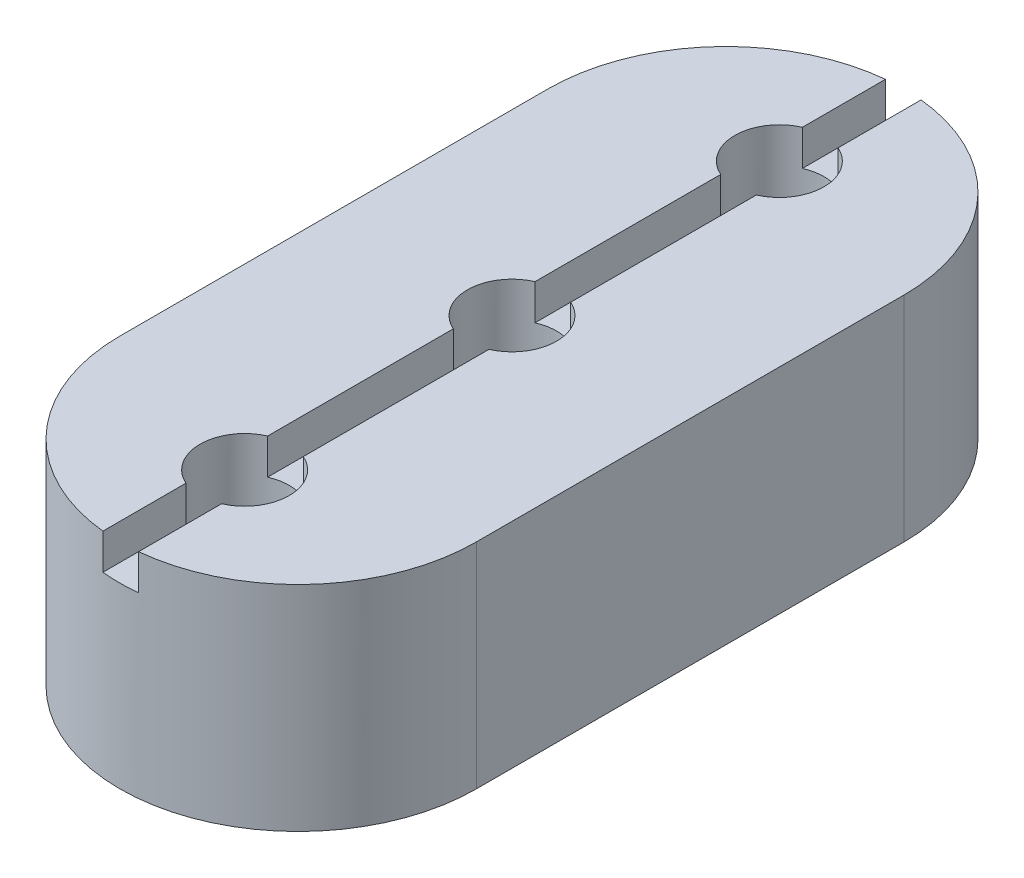
ISO-10303-21;
HEADER;
FILE_DESCRIPTION(('STEP AP214'),'2;1');
FILE_NAME('part.step','',(''),(''),'','','');
FILE_SCHEMA(('AUTOMOTIVE_DESIGN { 1 0 10303 214 1 1 1 1 }'));
ENDSEC;
DATA;
#1=APPLICATION_CONTEXT('core data for automotive mechanical design processes');
#2=APPLICATION_PROTOCOL_DEFINITION('international standard','automotive_design',2000,#1);
#3=PRODUCT_CONTEXT('',#1,'mechanical');
#4=PRODUCT('Part','Part','',(#3));
#5=PRODUCT_RELATED_PRODUCT_CATEGORY('part','',(#4));
#6=PRODUCT_DEFINITION_FORMATION('','',#4);
#7=PRODUCT_DEFINITION_CONTEXT('part definition',#1,'design');
#8=PRODUCT_DEFINITION('design','',#6,#7);
#9=PRODUCT_DEFINITION_SHAPE('','',#8);
#10=(LENGTH_UNIT() NAMED_UNIT(*) SI_UNIT(.MILLI.,.METRE.));
#11=(NAMED_UNIT(*) PLANE_ANGLE_UNIT() SI_UNIT($,.RADIAN.));
#12=(NAMED_UNIT(*) SI_UNIT($,.STERADIAN.) SOLID_ANGLE_UNIT());
#13=UNCERTAINTY_MEASURE_WITH_UNIT(LENGTH_MEASURE(1.E-05),#10,'distance_accuracy_value','');
#14=(GEOMETRIC_REPRESENTATION_CONTEXT(3) GLOBAL_UNCERTAINTY_ASSIGNED_CONTEXT((#13)) GLOBAL_UNIT_ASSIGNED_CONTEXT((#10,
#11,#12)) REPRESENTATION_CONTEXT('',''));
#15=CARTESIAN_POINT('',(0.,0.,0.));
#16=DIRECTION('',(0.,0.,1.));
#17=DIRECTION('',(1.,0.,0.));
#18=AXIS2_PLACEMENT_3D('',#15,#16,#17);
#19=CARTESIAN_POINT('',(0.,6.,12.));
#20=DIRECTION('',(0.,1.,0.));
#21=DIRECTION('',(0.,0.,1.));
#22=AXIS2_PLACEMENT_3D('',#19,#20,#21);
#23=CYLINDRICAL_SURFACE('',#22,10.);
#24=DIRECTION('',(0.,1.,0.));
#25=VECTOR('',#24,1.);
#26=CARTESIAN_POINT('',(10.,6.,12.));
#27=LINE('',#26,#25);
#28=CARTESIAN_POINT('',(10.,6.,12.));
#29=VERTEX_POINT('',#28);
#30=CARTESIAN_POINT('',(10.,-6.,12.));
#31=VERTEX_POINT('',#30);
#32=EDGE_CURVE('E309',#29,#31,#27,.F.);
#33=ORIENTED_EDGE('',*,*,#32,.F.);
#34=CARTESIAN_POINT('',(0.,6.,12.));
#35=DIRECTION('',(0.,-1.,0.));
#36=DIRECTION('',(0.,0.,-1.));
#37=AXIS2_PLACEMENT_3D('',#34,#35,#36);
#38=CIRCLE('',#37,10.);
#39=CARTESIAN_POINT('',(0.999999999999999,6.,21.9498743710662));
#40=VERTEX_POINT('',#39);
#41=EDGE_CURVE('E61',#40,#29,#38,.F.);
#42=ORIENTED_EDGE('',*,*,#41,.F.);
#43=DIRECTION('',(0.,1.,0.));
#44=VECTOR('',#43,1.);
#45=CARTESIAN_POINT('',(0.999999999999999,6.,21.9498743710662));
#46=LINE('',#45,#44);
#47=CARTESIAN_POINT('',(1.,4.,21.9498743710662));
#48=VERTEX_POINT('',#47);
#49=EDGE_CURVE('E71',#48,#40,#46,.T.);
#50=ORIENTED_EDGE('',*,*,#49,.F.);
#51=CARTESIAN_POINT('',(0.,4.,12.));
#52=DIRECTION('',(0.,-1.,0.));
#53=DIRECTION('',(0.,0.,-1.));
#54=AXIS2_PLACEMENT_3D('',#51,#52,#53);
#55=CIRCLE('',#54,10.);
#56=CARTESIAN_POINT('',(-1.,4.,21.9498743710662));
#57=VERTEX_POINT('',#56);
#58=EDGE_CURVE('E322',#57,#48,#55,.F.);
#59=ORIENTED_EDGE('',*,*,#58,.F.);
#60=DIRECTION('',(0.,1.,0.));
#61=VECTOR('',#60,1.);
#62=CARTESIAN_POINT('',(-1.,6.,21.9498743710662));
#63=LINE('',#62,#61);
#64=CARTESIAN_POINT('',(-1.,6.,21.9498743710662));
#65=VERTEX_POINT('',#64);
#66=EDGE_CURVE('E319',#65,#57,#63,.F.);
#67=ORIENTED_EDGE('',*,*,#66,.F.);
#68=CARTESIAN_POINT('',(0.,6.,12.));
#69=DIRECTION('',(0.,-1.,0.));
#70=DIRECTION('',(0.,0.,-1.));
#71=AXIS2_PLACEMENT_3D('',#68,#69,#70);
#72=CIRCLE('',#71,10.);
#73=CARTESIAN_POINT('',(-10.,6.,12.));
#74=VERTEX_POINT('',#73);
#75=EDGE_CURVE('E194',#74,#65,#72,.F.);
#76=ORIENTED_EDGE('',*,*,#75,.F.);
#77=DIRECTION('',(0.,1.,0.));
#78=VECTOR('',#77,1.);
#79=CARTESIAN_POINT('',(-10.,6.,12.));
#80=LINE('',#79,#78);
#81=CARTESIAN_POINT('',(-10.,-6.,12.));
#82=VERTEX_POINT('',#81);
#83=EDGE_CURVE('E313',#82,#74,#80,.T.);
#84=ORIENTED_EDGE('',*,*,#83,.F.);
#85=CARTESIAN_POINT('',(0.,-6.,12.));
#86=DIRECTION('',(0.,1.,0.));
#87=DIRECTION('',(0.,0.,1.));
#88=AXIS2_PLACEMENT_3D('',#85,#86,#87);
#89=CIRCLE('',#88,10.);
#90=EDGE_CURVE('E13',#31,#82,#89,.F.);
#91=ORIENTED_EDGE('',*,*,#90,.F.);
#92=EDGE_LOOP('',(#33,#42,#50,#59,#67,#76,#84,#91));
#93=FACE_BOUND('',#92,.T.);
#94=ADVANCED_FACE('F52',(#93),#23,.T.);
#95=CARTESIAN_POINT('',(0.,6.,-12.));
#96=DIRECTION('',(0.,-1.,0.));
#97=DIRECTION('',(0.,0.,-1.));
#98=AXIS2_PLACEMENT_3D('',#95,#96,#97);
#99=CYLINDRICAL_SURFACE('',#98,10.);
#100=DIRECTION('',(0.,1.,0.));
#101=VECTOR('',#100,1.);
#102=CARTESIAN_POINT('',(-10.,6.,-12.));
#103=LINE('',#102,#101);
#104=CARTESIAN_POINT('',(-10.,6.,-12.));
#105=VERTEX_POINT('',#104);
#106=CARTESIAN_POINT('',(-10.,-6.,-12.));
#107=VERTEX_POINT('',#106);
#108=EDGE_CURVE('E278',#105,#107,#103,.F.);
#109=ORIENTED_EDGE('',*,*,#108,.F.);
#110=CARTESIAN_POINT('',(0.,6.,-12.));
#111=DIRECTION('',(0.,-1.,0.));
#112=DIRECTION('',(0.,0.,-1.));
#113=AXIS2_PLACEMENT_3D('',#110,#111,#112);
#114=CIRCLE('',#113,10.);
#115=CARTESIAN_POINT('',(-1.,6.,-21.9498743710662));
#116=VERTEX_POINT('',#115);
#117=EDGE_CURVE('E302',#116,#105,#114,.F.);
#118=ORIENTED_EDGE('',*,*,#117,.F.);
#119=DIRECTION('',(0.,-1.,0.));
#120=VECTOR('',#119,1.);
#121=CARTESIAN_POINT('',(-1.,6.,-21.9498743710662));
#122=LINE('',#121,#120);
#123=CARTESIAN_POINT('',(-1.,4.,-21.9498743710662));
#124=VERTEX_POINT('',#123);
#125=EDGE_CURVE('E298',#124,#116,#122,.F.);
#126=ORIENTED_EDGE('',*,*,#125,.F.);
#127=CARTESIAN_POINT('',(0.,4.,-12.));
#128=DIRECTION('',(0.,-1.,0.));
#129=DIRECTION('',(0.,0.,-1.));
#130=AXIS2_PLACEMENT_3D('',#127,#128,#129);
#131=CIRCLE('',#130,10.);
#132=CARTESIAN_POINT('',(1.,4.,-21.9498743710662));
#133=VERTEX_POINT('',#132);
#134=EDGE_CURVE('E294',#133,#124,#131,.F.);
#135=ORIENTED_EDGE('',*,*,#134,.F.);
#136=DIRECTION('',(0.,-1.,0.));
#137=VECTOR('',#136,1.);
#138=CARTESIAN_POINT('',(0.999999999999999,6.,-21.9498743710662));
#139=LINE('',#138,#137);
#140=CARTESIAN_POINT('',(0.999999999999999,6.,-21.9498743710662));
#141=VERTEX_POINT('',#140);
#142=EDGE_CURVE('E290',#141,#133,#139,.T.);
#143=ORIENTED_EDGE('',*,*,#142,.F.);
#144=CARTESIAN_POINT('',(0.,6.,-12.));
#145=DIRECTION('',(0.,-1.,0.));
#146=DIRECTION('',(0.,0.,-1.));
#147=AXIS2_PLACEMENT_3D('',#144,#145,#146);
#148=CIRCLE('',#147,10.);
#149=CARTESIAN_POINT('',(10.,6.,-12.));
#150=VERTEX_POINT('',#149);
#151=EDGE_CURVE('E286',#150,#141,#148,.F.);
#152=ORIENTED_EDGE('',*,*,#151,.F.);
#153=DIRECTION('',(0.,1.,0.));
#154=VECTOR('',#153,1.);
#155=CARTESIAN_POINT('',(10.,6.,-12.));
#156=LINE('',#155,#154);
#157=CARTESIAN_POINT('',(10.,-6.,-12.));
#158=VERTEX_POINT('',#157);
#159=EDGE_CURVE('E282',#158,#150,#156,.T.);
#160=ORIENTED_EDGE('',*,*,#159,.F.);
#161=CARTESIAN_POINT('',(0.,-6.,-12.));
#162=DIRECTION('',(0.,1.,0.));
#163=DIRECTION('',(0.,0.,1.));
#164=AXIS2_PLACEMENT_3D('',#161,#162,#163);
#165=CIRCLE('',#164,10.);
#166=EDGE_CURVE('E306',#107,#158,#165,.F.);
#167=ORIENTED_EDGE('',*,*,#166,.F.);
#168=EDGE_LOOP('',(#109,#118,#126,#135,#143,#152,#160,#167));
#169=FACE_BOUND('',#168,.T.);
#170=ADVANCED_FACE('F343',(#169),#99,.T.);
#171=CARTESIAN_POINT('',(10.,6.,22.));
#172=DIRECTION('',(0.,-1.,0.));
#173=DIRECTION('',(0.,0.,-1.));
#174=AXIS2_PLACEMENT_3D('',#171,#172,#173);
#175=PLANE('',#174);
#176=DIRECTION('',(0.,0.,-1.));
#177=VECTOR('',#176,1.);
#178=CARTESIAN_POINT('',(-10.,6.,22.));
#179=LINE('',#178,#177);
#180=EDGE_CURVE('E254',#74,#105,#179,.T.);
#181=ORIENTED_EDGE('',*,*,#180,.F.);
#182=ORIENTED_EDGE('',*,*,#75,.T.);
#183=DIRECTION('',(0.,0.,-1.));
#184=VECTOR('',#183,1.);
#185=CARTESIAN_POINT('',(-1.,6.,22.));
#186=LINE('',#185,#184);
#187=CARTESIAN_POINT('',(-1.,6.,17.2912878474779));
#188=VERTEX_POINT('',#187);
#189=EDGE_CURVE('E187',#65,#188,#186,.T.);
#190=ORIENTED_EDGE('',*,*,#189,.T.);
#191=CARTESIAN_POINT('',(0.,6.,15.));
#192=DIRECTION('',(0.,1.,0.));
#193=DIRECTION('',(0.,0.,1.));
#194=AXIS2_PLACEMENT_3D('',#191,#192,#193);
#195=CIRCLE('',#194,2.49999999999999);
#196=CARTESIAN_POINT('',(-1.,6.,12.7087121525221));
#197=VERTEX_POINT('',#196);
#198=EDGE_CURVE('E193',#197,#188,#195,.T.);
#199=ORIENTED_EDGE('',*,*,#198,.F.);
#200=CARTESIAN_POINT('',(-1.,6.,2.29128784747791));
#201=VERTEX_POINT('',#200);
#202=EDGE_CURVE('E199',#197,#201,#186,.T.);
#203=ORIENTED_EDGE('',*,*,#202,.T.);
#204=CARTESIAN_POINT('',(0.,6.,0.));
#205=DIRECTION('',(0.,1.,0.));
#206=DIRECTION('',(0.,0.,1.));
#207=AXIS2_PLACEMENT_3D('',#204,#205,#206);
#208=CIRCLE('',#207,2.49999999999999);
#209=CARTESIAN_POINT('',(-1.,6.,-2.29128784747791));
#210=VERTEX_POINT('',#209);
#211=EDGE_CURVE('E236',#210,#201,#208,.T.);
#212=ORIENTED_EDGE('',*,*,#211,.F.);
#213=CARTESIAN_POINT('',(-1.,6.,-12.7087121525221));
#214=VERTEX_POINT('',#213);
#215=EDGE_CURVE('E424',#210,#214,#186,.T.);
#216=ORIENTED_EDGE('',*,*,#215,.T.);
#217=CARTESIAN_POINT('',(0.,6.,-15.));
#218=DIRECTION('',(0.,1.,0.));
#219=DIRECTION('',(0.,0.,1.));
#220=AXIS2_PLACEMENT_3D('',#217,#218,#219);
#221=CIRCLE('',#220,2.49999999999999);
#222=CARTESIAN_POINT('',(-1.,6.,-17.2912878474779));
#223=VERTEX_POINT('',#222);
#224=EDGE_CURVE('E245',#223,#214,#221,.T.);
#225=ORIENTED_EDGE('',*,*,#224,.F.);
#226=EDGE_CURVE('E201',#223,#116,#186,.T.);
#227=ORIENTED_EDGE('',*,*,#226,.T.);
#228=ORIENTED_EDGE('',*,*,#117,.T.);
#229=EDGE_LOOP('',(#181,#182,#190,#199,#203,#212,#216,#225,#227,#228));
#230=FACE_BOUND('',#229,.T.);
#231=ADVANCED_FACE('F190',(#230),#175,.F.);
#232=DIRECTION('',(0.,0.,-1.));
#233=VECTOR('',#232,1.);
#234=CARTESIAN_POINT('',(0.999999999999999,6.,22.));
#235=LINE('',#234,#233);
#236=CARTESIAN_POINT('',(0.999999999999997,6.,17.2912878474779));
#237=VERTEX_POINT('',#236);
#238=EDGE_CURVE('E334',#40,#237,#235,.T.);
#239=ORIENTED_EDGE('',*,*,#238,.F.);
#240=ORIENTED_EDGE('',*,*,#41,.T.);
#241=DIRECTION('',(0.,0.,-1.));
#242=VECTOR('',#241,1.);
#243=CARTESIAN_POINT('',(10.,6.,22.));
#244=LINE('',#243,#242);
#245=EDGE_CURVE('E257',#29,#150,#244,.T.);
#246=ORIENTED_EDGE('',*,*,#245,.T.);
#247=ORIENTED_EDGE('',*,*,#151,.T.);
#248=CARTESIAN_POINT('',(0.999999999999999,6.,-17.2912878474779));
#249=VERTEX_POINT('',#248);
#250=EDGE_CURVE('E198',#249,#141,#235,.T.);
#251=ORIENTED_EDGE('',*,*,#250,.F.);
#252=CARTESIAN_POINT('',(0.999999999999999,6.,-12.7087121525221));
#253=VERTEX_POINT('',#252);
#254=EDGE_CURVE('E246',#253,#249,#221,.T.);
#255=ORIENTED_EDGE('',*,*,#254,.F.);
#256=CARTESIAN_POINT('',(0.999999999999999,6.,-2.29128784747791));
#257=VERTEX_POINT('',#256);
#258=EDGE_CURVE('E352',#257,#253,#235,.T.);
#259=ORIENTED_EDGE('',*,*,#258,.F.);
#260=CARTESIAN_POINT('',(0.999999999999999,6.,2.29128784747791));
#261=VERTEX_POINT('',#260);
#262=EDGE_CURVE('E237',#261,#257,#208,.T.);
#263=ORIENTED_EDGE('',*,*,#262,.F.);
#264=CARTESIAN_POINT('',(0.999999999999999,6.,12.7087121525221));
#265=VERTEX_POINT('',#264);
#266=EDGE_CURVE('E355',#265,#261,#235,.T.);
#267=ORIENTED_EDGE('',*,*,#266,.F.);
#268=EDGE_CURVE('E219',#237,#265,#195,.T.);
#269=ORIENTED_EDGE('',*,*,#268,.F.);
#270=EDGE_LOOP('',(#239,#240,#246,#247,#251,#255,#259,#263,#267,#269));
#271=FACE_BOUND('',#270,.T.);
#272=ADVANCED_FACE('F330',(#271),#175,.F.);
#273=CARTESIAN_POINT('',(-10.,6.,22.));
#274=DIRECTION('',(1.,0.,0.));
#275=DIRECTION('',(0.,0.,-1.));
#276=AXIS2_PLACEMENT_3D('',#273,#274,#275);
#277=PLANE('',#276);
#278=DIRECTION('',(0.,0.,-1.));
#279=VECTOR('',#278,1.);
#280=CARTESIAN_POINT('',(-10.,-6.,22.));
#281=LINE('',#280,#279);
#282=EDGE_CURVE('E263',#82,#107,#281,.T.);
#283=ORIENTED_EDGE('',*,*,#282,.F.);
#284=ORIENTED_EDGE('',*,*,#83,.T.);
#285=ORIENTED_EDGE('',*,*,#180,.T.);
#286=ORIENTED_EDGE('',*,*,#108,.T.);
#287=EDGE_LOOP('',(#283,#284,#285,#286));
#288=FACE_BOUND('',#287,.T.);
#289=ADVANCED_FACE('F487',(#288),#277,.F.);
#290=CARTESIAN_POINT('',(10.,-6.,22.));
#291=DIRECTION('',(0.,1.,0.));
#292=DIRECTION('',(0.,0.,1.));
#293=AXIS2_PLACEMENT_3D('',#290,#291,#292);
#294=PLANE('',#293);
#295=CARTESIAN_POINT('',(0.,-6.,15.));
#296=DIRECTION('',(0.,1.,0.));
#297=DIRECTION('',(0.,0.,1.));
#298=AXIS2_PLACEMENT_3D('',#295,#296,#297);
#299=CIRCLE('',#298,2.5);
#300=CARTESIAN_POINT('',(0.,-6.,17.5));
#301=VERTEX_POINT('',#300);
#302=EDGE_CURVE('E226',#301,#301,#299,.T.);
#303=ORIENTED_EDGE('',*,*,#302,.T.);
#304=EDGE_LOOP('',(#303));
#305=FACE_BOUND('',#304,.T.);
#306=CARTESIAN_POINT('',(0.,-6.,0.));
#307=DIRECTION('',(0.,1.,0.));
#308=DIRECTION('',(0.,0.,1.));
#309=AXIS2_PLACEMENT_3D('',#306,#307,#308);
#310=CIRCLE('',#309,2.5);
#311=CARTESIAN_POINT('',(0.,-6.,2.5));
#312=VERTEX_POINT('',#311);
#313=EDGE_CURVE('E241',#312,#312,#310,.T.);
#314=ORIENTED_EDGE('',*,*,#313,.T.);
#315=EDGE_LOOP('',(#314));
#316=FACE_BOUND('',#315,.T.);
#317=CARTESIAN_POINT('',(0.,-6.,-15.));
#318=DIRECTION('',(0.,1.,0.));
#319=DIRECTION('',(0.,0.,1.));
#320=AXIS2_PLACEMENT_3D('',#317,#318,#319);
#321=CIRCLE('',#320,2.5);
#322=CARTESIAN_POINT('',(0.,-6.,-12.5));
#323=VERTEX_POINT('',#322);
#324=EDGE_CURVE('E250',#323,#323,#321,.T.);
#325=ORIENTED_EDGE('',*,*,#324,.T.);
#326=EDGE_LOOP('',(#325));
#327=FACE_BOUND('',#326,.T.);
#328=DIRECTION('',(0.,0.,-1.));
#329=VECTOR('',#328,1.);
#330=CARTESIAN_POINT('',(10.,-6.,22.));
#331=LINE('',#330,#329);
#332=EDGE_CURVE('E260',#31,#158,#331,.T.);
#333=ORIENTED_EDGE('',*,*,#332,.F.);
#334=ORIENTED_EDGE('',*,*,#90,.T.);
#335=ORIENTED_EDGE('',*,*,#282,.T.);
#336=ORIENTED_EDGE('',*,*,#166,.T.);
#337=EDGE_LOOP('',(#333,#334,#335,#336));
#338=FACE_BOUND('',#337,.T.);
#339=ADVANCED_FACE('F490',(#305,#316,#327,#338),#294,.F.);
#340=CARTESIAN_POINT('',(10.,6.,22.));
#341=DIRECTION('',(-1.,0.,0.));
#342=DIRECTION('',(0.,0.,1.));
#343=AXIS2_PLACEMENT_3D('',#340,#341,#342);
#344=PLANE('',#343);
#345=ORIENTED_EDGE('',*,*,#245,.F.);
#346=ORIENTED_EDGE('',*,*,#32,.T.);
#347=ORIENTED_EDGE('',*,*,#332,.T.);
#348=ORIENTED_EDGE('',*,*,#159,.T.);
#349=EDGE_LOOP('',(#345,#346,#347,#348));
#350=FACE_BOUND('',#349,.T.);
#351=ADVANCED_FACE('F338',(#350),#344,.F.);
#352=CARTESIAN_POINT('',(0.,6.,-15.));
#353=DIRECTION('',(0.,1.,0.));
#354=DIRECTION('',(0.,0.,1.));
#355=AXIS2_PLACEMENT_3D('',#352,#353,#354);
#356=CYLINDRICAL_SURFACE('',#355,2.49999999999999);
#357=ORIENTED_EDGE('',*,*,#324,.F.);
#358=EDGE_LOOP('',(#357));
#359=FACE_BOUND('',#358,.T.);
#360=CARTESIAN_POINT('',(0.,4.,-15.));
#361=DIRECTION('',(0.,-1.,0.));
#362=DIRECTION('',(0.,0.,-1.));
#363=AXIS2_PLACEMENT_3D('',#360,#361,#362);
#364=CIRCLE('',#363,2.49999999999999);
#365=CARTESIAN_POINT('',(0.999999999999999,4.,-17.2912878474779));
#366=VERTEX_POINT('',#365);
#367=CARTESIAN_POINT('',(-1.,4.,-17.2912878474779));
#368=VERTEX_POINT('',#367);
#369=EDGE_CURVE('E404',#366,#368,#364,.F.);
#370=ORIENTED_EDGE('',*,*,#369,.T.);
#371=DIRECTION('',(0.,1.,0.));
#372=VECTOR('',#371,1.);
#373=CARTESIAN_POINT('',(-1.,6.,-17.2912878474779));
#374=LINE('',#373,#372);
#375=EDGE_CURVE('E229',#368,#223,#374,.T.);
#376=ORIENTED_EDGE('',*,*,#375,.T.);
#377=ORIENTED_EDGE('',*,*,#224,.T.);
#378=DIRECTION('',(0.,1.,0.));
#379=VECTOR('',#378,1.);
#380=CARTESIAN_POINT('',(-1.,6.,-12.7087121525221));
#381=LINE('',#380,#379);
#382=CARTESIAN_POINT('',(-1.,4.,-12.7087121525221));
#383=VERTEX_POINT('',#382);
#384=EDGE_CURVE('E220',#214,#383,#381,.F.);
#385=ORIENTED_EDGE('',*,*,#384,.T.);
#386=CARTESIAN_POINT('',(1.,4.,-12.7087121525221));
#387=VERTEX_POINT('',#386);
#388=EDGE_CURVE('E393',#383,#387,#364,.F.);
#389=ORIENTED_EDGE('',*,*,#388,.T.);
#390=DIRECTION('',(0.,1.,0.));
#391=VECTOR('',#390,1.);
#392=CARTESIAN_POINT('',(0.999999999999999,6.,-12.7087121525221));
#393=LINE('',#392,#391);
#394=EDGE_CURVE('E387',#387,#253,#393,.T.);
#395=ORIENTED_EDGE('',*,*,#394,.T.);
#396=ORIENTED_EDGE('',*,*,#254,.T.);
#397=DIRECTION('',(0.,1.,0.));
#398=VECTOR('',#397,1.);
#399=CARTESIAN_POINT('',(0.999999999999999,6.,-17.2912878474779));
#400=LINE('',#399,#398);
#401=EDGE_CURVE('E351',#249,#366,#400,.F.);
#402=ORIENTED_EDGE('',*,*,#401,.T.);
#403=EDGE_LOOP('',(#370,#376,#377,#385,#389,#395,#396,#402));
#404=FACE_BOUND('',#403,.T.);
#405=ADVANCED_FACE('F392',(#359,#404),#356,.F.);
#406=CARTESIAN_POINT('',(0.,6.,0.));
#407=DIRECTION('',(0.,1.,0.));
#408=DIRECTION('',(0.,0.,1.));
#409=AXIS2_PLACEMENT_3D('',#406,#407,#408);
#410=CYLINDRICAL_SURFACE('',#409,2.49999999999999);
#411=ORIENTED_EDGE('',*,*,#313,.F.);
#412=EDGE_LOOP('',(#411));
#413=FACE_BOUND('',#412,.T.);
#414=CARTESIAN_POINT('',(0.,4.,0.));
#415=DIRECTION('',(0.,-1.,0.));
#416=DIRECTION('',(0.,0.,-1.));
#417=AXIS2_PLACEMENT_3D('',#414,#415,#416);
#418=CIRCLE('',#417,2.49999999999999);
#419=CARTESIAN_POINT('',(0.999999999999999,4.,-2.29128784747791));
#420=VERTEX_POINT('',#419);
#421=CARTESIAN_POINT('',(-1.,4.,-2.29128784747791));
#422=VERTEX_POINT('',#421);
#423=EDGE_CURVE('E397',#420,#422,#418,.F.);
#424=ORIENTED_EDGE('',*,*,#423,.T.);
#425=DIRECTION('',(0.,1.,0.));
#426=VECTOR('',#425,1.);
#427=CARTESIAN_POINT('',(-1.,6.,-2.29128784747791));
#428=LINE('',#427,#426);
#429=EDGE_CURVE('E407',#422,#210,#428,.T.);
#430=ORIENTED_EDGE('',*,*,#429,.T.);
#431=ORIENTED_EDGE('',*,*,#211,.T.);
#432=DIRECTION('',(0.,1.,0.));
#433=VECTOR('',#432,1.);
#434=CARTESIAN_POINT('',(-1.,6.,2.29128784747791));
#435=LINE('',#434,#433);
#436=CARTESIAN_POINT('',(-1.,4.,2.29128784747791));
#437=VERTEX_POINT('',#436);
#438=EDGE_CURVE('E411',#201,#437,#435,.F.);
#439=ORIENTED_EDGE('',*,*,#438,.T.);
#440=CARTESIAN_POINT('',(1.,4.,2.29128784747791));
#441=VERTEX_POINT('',#440);
#442=EDGE_CURVE('E379',#437,#441,#418,.F.);
#443=ORIENTED_EDGE('',*,*,#442,.T.);
#444=DIRECTION('',(0.,1.,0.));
#445=VECTOR('',#444,1.);
#446=CARTESIAN_POINT('',(0.999999999999999,6.,2.29128784747791));
#447=LINE('',#446,#445);
#448=EDGE_CURVE('E370',#441,#261,#447,.T.);
#449=ORIENTED_EDGE('',*,*,#448,.T.);
#450=ORIENTED_EDGE('',*,*,#262,.T.);
#451=DIRECTION('',(0.,1.,0.));
#452=VECTOR('',#451,1.);
#453=CARTESIAN_POINT('',(0.999999999999999,6.,-2.29128784747791));
#454=LINE('',#453,#452);
#455=EDGE_CURVE('E381',#257,#420,#454,.F.);
#456=ORIENTED_EDGE('',*,*,#455,.T.);
#457=EDGE_LOOP('',(#424,#430,#431,#439,#443,#449,#450,#456));
#458=FACE_BOUND('',#457,.T.);
#459=ADVANCED_FACE('F376',(#413,#458),#410,.F.);
#460=CARTESIAN_POINT('',(0.,6.,15.));
#461=DIRECTION('',(0.,1.,0.));
#462=DIRECTION('',(0.,0.,1.));
#463=AXIS2_PLACEMENT_3D('',#460,#461,#462);
#464=CYLINDRICAL_SURFACE('',#463,2.49999999999999);
#465=ORIENTED_EDGE('',*,*,#302,.F.);
#466=EDGE_LOOP('',(#465));
#467=FACE_BOUND('',#466,.T.);
#468=CARTESIAN_POINT('',(0.,4.,15.));
#469=DIRECTION('',(0.,-1.,0.));
#470=DIRECTION('',(0.,0.,-1.));
#471=AXIS2_PLACEMENT_3D('',#468,#469,#470);
#472=CIRCLE('',#471,2.49999999999999);
#473=CARTESIAN_POINT('',(0.999999999999999,4.,12.7087121525221));
#474=VERTEX_POINT('',#473);
#475=CARTESIAN_POINT('',(-1.,4.,12.7087121525221));
#476=VERTEX_POINT('',#475);
#477=EDGE_CURVE('E271',#474,#476,#472,.F.);
#478=ORIENTED_EDGE('',*,*,#477,.T.);
#479=DIRECTION('',(0.,1.,0.));
#480=VECTOR('',#479,1.);
#481=CARTESIAN_POINT('',(-1.,6.,12.7087121525221));
#482=LINE('',#481,#480);
#483=EDGE_CURVE('E217',#476,#197,#482,.T.);
#484=ORIENTED_EDGE('',*,*,#483,.T.);
#485=ORIENTED_EDGE('',*,*,#198,.T.);
#486=DIRECTION('',(0.,1.,0.));
#487=VECTOR('',#486,1.);
#488=CARTESIAN_POINT('',(-1.,6.,17.2912878474779));
#489=LINE('',#488,#487);
#490=CARTESIAN_POINT('',(-1.,4.,17.2912878474779));
#491=VERTEX_POINT('',#490);
#492=EDGE_CURVE('E203',#188,#491,#489,.F.);
#493=ORIENTED_EDGE('',*,*,#492,.T.);
#494=CARTESIAN_POINT('',(1.,4.,17.2912878474779));
#495=VERTEX_POINT('',#494);
#496=EDGE_CURVE('E212',#491,#495,#472,.F.);
#497=ORIENTED_EDGE('',*,*,#496,.T.);
#498=DIRECTION('',(0.,1.,0.));
#499=VECTOR('',#498,1.);
#500=CARTESIAN_POINT('',(0.999999999999999,6.,17.2912878474779));
#501=LINE('',#500,#499);
#502=EDGE_CURVE('E266',#495,#237,#501,.T.);
#503=ORIENTED_EDGE('',*,*,#502,.T.);
#504=ORIENTED_EDGE('',*,*,#268,.T.);
#505=DIRECTION('',(0.,1.,0.));
#506=VECTOR('',#505,1.);
#507=CARTESIAN_POINT('',(0.999999999999999,6.,12.7087121525221));
#508=LINE('',#507,#506);
#509=EDGE_CURVE('E211',#265,#474,#508,.F.);
#510=ORIENTED_EDGE('',*,*,#509,.T.);
#511=EDGE_LOOP('',(#478,#484,#485,#493,#497,#503,#504,#510));
#512=FACE_BOUND('',#511,.T.);
#513=ADVANCED_FACE('F216',(#467,#512),#464,.F.);
#514=CARTESIAN_POINT('',(1.,4.,22.));
#515=DIRECTION('',(1.,0.,0.));
#516=DIRECTION('',(0.,1.,0.));
#517=AXIS2_PLACEMENT_3D('',#514,#515,#516);
#518=PLANE('',#517);
#519=DIRECTION('',(0.,0.,-1.));
#520=VECTOR('',#519,1.);
#521=CARTESIAN_POINT('',(1.,4.,22.));
#522=LINE('',#521,#520);
#523=EDGE_CURVE('E364',#48,#495,#522,.T.);
#524=ORIENTED_EDGE('',*,*,#523,.F.);
#525=ORIENTED_EDGE('',*,*,#49,.T.);
#526=ORIENTED_EDGE('',*,*,#238,.T.);
#527=ORIENTED_EDGE('',*,*,#502,.F.);
#528=EDGE_LOOP('',(#524,#525,#526,#527));
#529=FACE_BOUND('',#528,.T.);
#530=ADVANCED_FACE('F460',(#529),#518,.F.);
#531=CARTESIAN_POINT('',(1.,4.,22.));
#532=DIRECTION('',(0.,-1.,0.));
#533=DIRECTION('',(0.,0.,-1.));
#534=AXIS2_PLACEMENT_3D('',#531,#532,#533);
#535=PLANE('',#534);
#536=DIRECTION('',(0.,0.,-1.));
#537=VECTOR('',#536,1.);
#538=CARTESIAN_POINT('',(-1.,4.,22.));
#539=LINE('',#538,#537);
#540=EDGE_CURVE('E206',#57,#491,#539,.T.);
#541=ORIENTED_EDGE('',*,*,#540,.F.);
#542=ORIENTED_EDGE('',*,*,#58,.T.);
#543=ORIENTED_EDGE('',*,*,#523,.T.);
#544=ORIENTED_EDGE('',*,*,#496,.F.);
#545=EDGE_LOOP('',(#541,#542,#543,#544));
#546=FACE_BOUND('',#545,.T.);
#547=ADVANCED_FACE('F462',(#546),#535,.F.);
#548=CARTESIAN_POINT('',(-1.,4.,22.));
#549=DIRECTION('',(-1.,0.,0.));
#550=DIRECTION('',(0.,-1.,0.));
#551=AXIS2_PLACEMENT_3D('',#548,#549,#550);
#552=PLANE('',#551);
#553=ORIENTED_EDGE('',*,*,#189,.F.);
#554=ORIENTED_EDGE('',*,*,#66,.T.);
#555=ORIENTED_EDGE('',*,*,#540,.T.);
#556=ORIENTED_EDGE('',*,*,#492,.F.);
#557=EDGE_LOOP('',(#553,#554,#555,#556));
#558=FACE_BOUND('',#557,.T.);
#559=ADVANCED_FACE('F204',(#558),#552,.F.);
#560=EDGE_CURVE('E428',#474,#441,#522,.T.);
#561=ORIENTED_EDGE('',*,*,#560,.F.);
#562=ORIENTED_EDGE('',*,*,#509,.F.);
#563=ORIENTED_EDGE('',*,*,#266,.T.);
#564=ORIENTED_EDGE('',*,*,#448,.F.);
#565=EDGE_LOOP('',(#561,#562,#563,#564));
#566=FACE_BOUND('',#565,.T.);
#567=ADVANCED_FACE('F369',(#566),#518,.F.);
#568=EDGE_CURVE('E436',#476,#437,#539,.T.);
#569=ORIENTED_EDGE('',*,*,#568,.F.);
#570=ORIENTED_EDGE('',*,*,#477,.F.);
#571=ORIENTED_EDGE('',*,*,#560,.T.);
#572=ORIENTED_EDGE('',*,*,#442,.F.);
#573=EDGE_LOOP('',(#569,#570,#571,#572));
#574=FACE_BOUND('',#573,.T.);
#575=ADVANCED_FACE('F458',(#574),#535,.F.);
#576=ORIENTED_EDGE('',*,*,#202,.F.);
#577=ORIENTED_EDGE('',*,*,#483,.F.);
#578=ORIENTED_EDGE('',*,*,#568,.T.);
#579=ORIENTED_EDGE('',*,*,#438,.F.);
#580=EDGE_LOOP('',(#576,#577,#578,#579));
#581=FACE_BOUND('',#580,.T.);
#582=ADVANCED_FACE('F455',(#581),#552,.F.);
#583=EDGE_CURVE('E363',#420,#387,#522,.T.);
#584=ORIENTED_EDGE('',*,*,#583,.F.);
#585=ORIENTED_EDGE('',*,*,#455,.F.);
#586=ORIENTED_EDGE('',*,*,#258,.T.);
#587=ORIENTED_EDGE('',*,*,#394,.F.);
#588=EDGE_LOOP('',(#584,#585,#586,#587));
#589=FACE_BOUND('',#588,.T.);
#590=ADVANCED_FACE('F386',(#589),#518,.F.);
#591=EDGE_CURVE('E432',#422,#383,#539,.T.);
#592=ORIENTED_EDGE('',*,*,#591,.F.);
#593=ORIENTED_EDGE('',*,*,#423,.F.);
#594=ORIENTED_EDGE('',*,*,#583,.T.);
#595=ORIENTED_EDGE('',*,*,#388,.F.);
#596=EDGE_LOOP('',(#592,#593,#594,#595));
#597=FACE_BOUND('',#596,.T.);
#598=ADVANCED_FACE('F449',(#597),#535,.F.);
#599=ORIENTED_EDGE('',*,*,#215,.F.);
#600=ORIENTED_EDGE('',*,*,#429,.F.);
#601=ORIENTED_EDGE('',*,*,#591,.T.);
#602=ORIENTED_EDGE('',*,*,#384,.F.);
#603=EDGE_LOOP('',(#599,#600,#601,#602));
#604=FACE_BOUND('',#603,.T.);
#605=ADVANCED_FACE('F446',(#604),#552,.F.);
#606=EDGE_CURVE('E427',#368,#124,#539,.T.);
#607=ORIENTED_EDGE('',*,*,#606,.T.);
#608=ORIENTED_EDGE('',*,*,#125,.T.);
#609=ORIENTED_EDGE('',*,*,#226,.F.);
#610=ORIENTED_EDGE('',*,*,#375,.F.);
#611=EDGE_LOOP('',(#607,#608,#609,#610));
#612=FACE_BOUND('',#611,.T.);
#613=ADVANCED_FACE('F504',(#612),#552,.F.);
#614=EDGE_CURVE('E358',#366,#133,#522,.T.);
#615=ORIENTED_EDGE('',*,*,#614,.T.);
#616=ORIENTED_EDGE('',*,*,#134,.T.);
#617=ORIENTED_EDGE('',*,*,#606,.F.);
#618=ORIENTED_EDGE('',*,*,#369,.F.);
#619=EDGE_LOOP('',(#615,#616,#617,#618));
#620=FACE_BOUND('',#619,.T.);
#621=ADVANCED_FACE('F473',(#620),#535,.F.);
#622=ORIENTED_EDGE('',*,*,#250,.T.);
#623=ORIENTED_EDGE('',*,*,#142,.T.);
#624=ORIENTED_EDGE('',*,*,#614,.F.);
#625=ORIENTED_EDGE('',*,*,#401,.F.);
#626=EDGE_LOOP('',(#622,#623,#624,#625));
#627=FACE_BOUND('',#626,.T.);
#628=ADVANCED_FACE('F348',(#627),#518,.F.);
#629=CLOSED_SHELL('',(#94,#170,#231,#272,#289,#339,#351,#405,#459,#513,#530,#547,#559,#567,#575,
#582,#590,#598,#605,#613,#621,#628));
#630=MANIFOLD_SOLID_BREP('B2',#629);
#631=ADVANCED_BREP_SHAPE_REPRESENTATION('',(#18,#630),#14);
#632=SHAPE_DEFINITION_REPRESENTATION(#9,#631);
ENDSEC;
END-ISO-10303-21;
